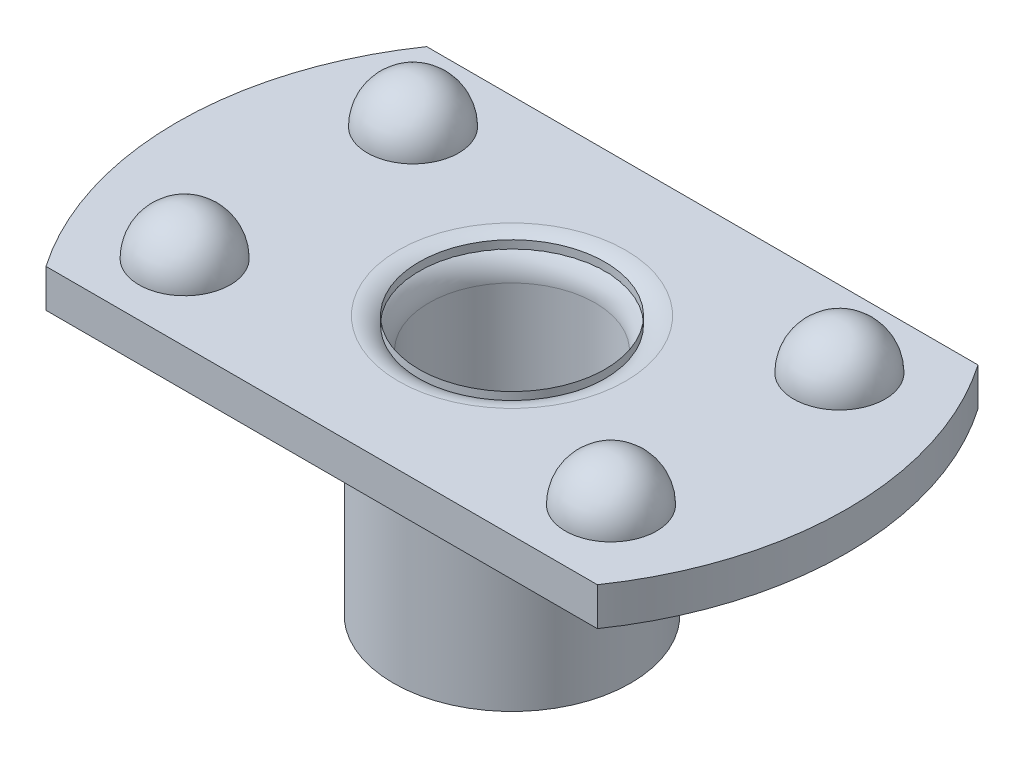
ISO-10303-21;
HEADER;
FILE_DESCRIPTION(('STEP AP214'),'2;1');
FILE_NAME('part.step','',(''),(''),'','','');
FILE_SCHEMA(('AUTOMOTIVE_DESIGN { 1 0 10303 214 1 1 1 1 }'));
ENDSEC;
DATA;
#1=APPLICATION_CONTEXT('core data for automotive mechanical design processes');
#2=APPLICATION_PROTOCOL_DEFINITION('international standard','automotive_design',2000,#1);
#3=PRODUCT_CONTEXT('',#1,'mechanical');
#4=PRODUCT('Part','Part','',(#3));
#5=PRODUCT_RELATED_PRODUCT_CATEGORY('part','',(#4));
#6=PRODUCT_DEFINITION_FORMATION('','',#4);
#7=PRODUCT_DEFINITION_CONTEXT('part definition',#1,'design');
#8=PRODUCT_DEFINITION('design','',#6,#7);
#9=PRODUCT_DEFINITION_SHAPE('','',#8);
#10=(LENGTH_UNIT() NAMED_UNIT(*) SI_UNIT(.MILLI.,.METRE.));
#11=(NAMED_UNIT(*) PLANE_ANGLE_UNIT() SI_UNIT($,.RADIAN.));
#12=(NAMED_UNIT(*) SI_UNIT($,.STERADIAN.) SOLID_ANGLE_UNIT());
#13=UNCERTAINTY_MEASURE_WITH_UNIT(LENGTH_MEASURE(1.E-05),#10,'distance_accuracy_value','');
#14=(GEOMETRIC_REPRESENTATION_CONTEXT(3) GLOBAL_UNCERTAINTY_ASSIGNED_CONTEXT((#13)) GLOBAL_UNIT_ASSIGNED_CONTEXT((#10,
#11,#12)) REPRESENTATION_CONTEXT('',''));
#15=CARTESIAN_POINT('',(0.,0.,0.));
#16=DIRECTION('',(0.,0.,1.));
#17=DIRECTION('',(1.,0.,0.));
#18=AXIS2_PLACEMENT_3D('',#15,#16,#17);
#19=CARTESIAN_POINT('',(0.,-9.99999999999999,84.33));
#20=DIRECTION('',(0.,1.,0.));
#21=DIRECTION('',(-1.,0.,0.));
#22=AXIS2_PLACEMENT_3D('',#19,#20,#21);
#23=CYLINDRICAL_SURFACE('',#22,3.05412658773999);
#24=CARTESIAN_POINT('',(0.,-1.50000000000027,84.33));
#25=DIRECTION('',(0.,1.,0.));
#26=DIRECTION('',(0.,0.,1.));
#27=AXIS2_PLACEMENT_3D('',#24,#25,#26);
#28=CIRCLE('',#27,3.05412658773999);
#29=CARTESIAN_POINT('',(0.,-1.50000000000027,87.38412658774));
#30=VERTEX_POINT('',#29);
#31=EDGE_CURVE('P0_E10',#30,#30,#28,.T.);
#32=ORIENTED_EDGE('',*,*,#31,.T.);
#33=EDGE_LOOP('',(#32));
#34=FACE_BOUND('',#33,.T.);
#35=CARTESIAN_POINT('',(0.,-9.99999999999999,84.33));
#36=DIRECTION('',(0.,1.,0.));
#37=DIRECTION('',(0.,0.,1.));
#38=AXIS2_PLACEMENT_3D('',#35,#36,#37);
#39=CIRCLE('',#38,3.05412658773997);
#40=CARTESIAN_POINT('',(0.,-9.99999999999999,87.38412658774));
#41=VERTEX_POINT('',#40);
#42=EDGE_CURVE('P0_E15',#41,#41,#39,.F.);
#43=ORIENTED_EDGE('',*,*,#42,.T.);
#44=EDGE_LOOP('',(#43));
#45=FACE_BOUND('',#44,.T.);
#46=ADVANCED_FACE('P0_F14',(#34,#45),#23,.F.);
#47=OPEN_SHELL('',(#46));
#48=SHELL_BASED_SURFACE_MODEL('P0_B1',(#47));
#49=CARTESIAN_POINT('',(0.,-3.25,84.33));
#50=DIRECTION('',(0.,1.,0.));
#51=DIRECTION('',(0.,0.,-1.));
#52=AXIS2_PLACEMENT_3D('',#49,#50,#51);
#53=TOROIDAL_SURFACE('',#52,4.39999999999999,0.5);
#54=CARTESIAN_POINT('',(0.,-3.25000000000021,84.33));
#55=DIRECTION('',(0.,1.,0.));
#56=DIRECTION('',(0.,0.,-1.));
#57=AXIS2_PLACEMENT_3D('',#54,#55,#56);
#58=CIRCLE('',#57,3.90000000000001);
#59=CARTESIAN_POINT('',(0.,-3.25000000000021,80.43));
#60=VERTEX_POINT('',#59);
#61=EDGE_CURVE('P1_E95',#60,#60,#58,.T.);
#62=ORIENTED_EDGE('',*,*,#61,.T.);
#63=EDGE_LOOP('',(#62));
#64=FACE_BOUND('',#63,.T.);
#65=CARTESIAN_POINT('',(0.,-2.75,84.33));
#66=DIRECTION('',(0.,-1.,0.));
#67=DIRECTION('',(0.,0.,-1.));
#68=AXIS2_PLACEMENT_3D('',#65,#66,#67);
#69=CIRCLE('',#68,4.39999999999999);
#70=CARTESIAN_POINT('',(3.6344260934129E-13,-2.75,79.93));
#71=VERTEX_POINT('',#70);
#72=CARTESIAN_POINT('',(-5.46659616280914E-13,-2.75,88.73));
#73=VERTEX_POINT('',#72);
#74=EDGE_CURVE('P1_E140',#71,#73,#69,.T.);
#75=ORIENTED_EDGE('',*,*,#74,.T.);
#76=CARTESIAN_POINT('',(0.,-2.75,84.33));
#77=DIRECTION('',(0.,-1.,0.));
#78=DIRECTION('',(-2.07068036470044E-13,0.,1.));
#79=AXIS2_PLACEMENT_3D('',#76,#77,#78);
#80=CIRCLE('',#79,4.39999999999999);
#81=EDGE_CURVE('P1_E114',#73,#71,#80,.T.);
#82=ORIENTED_EDGE('',*,*,#81,.T.);
#83=EDGE_LOOP('',(#75,#82));
#84=FACE_BOUND('',#83,.T.);
#85=ADVANCED_FACE('P1_F16',(#64,#84),#53,.F.);
#86=CARTESIAN_POINT('',(11.44761709894,-2.75,90.83));
#87=DIRECTION('',(0.,1.,0.));
#88=DIRECTION('',(0.,0.,-1.));
#89=AXIS2_PLACEMENT_3D('',#86,#87,#88);
#90=PLANE('',#89);
#91=ORIENTED_EDGE('',*,*,#74,.F.);
#92=ORIENTED_EDGE('',*,*,#81,.F.);
#93=EDGE_LOOP('',(#91,#92));
#94=FACE_BOUND('',#93,.T.);
#95=DIRECTION('',(-1.,0.,0.));
#96=VECTOR('',#95,1.);
#97=CARTESIAN_POINT('',(0.,-2.75000000000017,90.58));
#98=LINE('',#97,#96);
#99=CARTESIAN_POINT('',(9.05193349511453,-2.75000000000016,90.5800000000019));
#100=VERTEX_POINT('',#99);
#101=CARTESIAN_POINT('',(-9.05193349511566,-2.75000000000016,90.58));
#102=VERTEX_POINT('',#101);
#103=EDGE_CURVE('P1_E82',#100,#102,#98,.T.);
#104=ORIENTED_EDGE('',*,*,#103,.T.);
#105=CARTESIAN_POINT('',(0.,-2.75000000000016,84.33));
#106=DIRECTION('',(0.,1.,0.));
#107=DIRECTION('',(0.,0.,1.));
#108=AXIS2_PLACEMENT_3D('',#105,#106,#107);
#109=CIRCLE('',#108,11.);
#110=CARTESIAN_POINT('',(-9.05193349511581,-2.75000000000016,78.08));
#111=VERTEX_POINT('',#110);
#112=EDGE_CURVE('P1_E97',#102,#111,#109,.F.);
#113=ORIENTED_EDGE('',*,*,#112,.T.);
#114=DIRECTION('',(1.,0.,0.));
#115=VECTOR('',#114,1.);
#116=CARTESIAN_POINT('',(0.,-2.75000000000017,78.08));
#117=LINE('',#116,#115);
#118=CARTESIAN_POINT('',(9.0519334951158,-2.75000000000016,78.08));
#119=VERTEX_POINT('',#118);
#120=EDGE_CURVE('P1_E87',#111,#119,#117,.T.);
#121=ORIENTED_EDGE('',*,*,#120,.T.);
#122=CARTESIAN_POINT('',(0.,-2.75000000000016,84.33));
#123=DIRECTION('',(0.,1.,0.));
#124=DIRECTION('',(0.,0.,1.));
#125=AXIS2_PLACEMENT_3D('',#122,#123,#124);
#126=CIRCLE('',#125,11.);
#127=EDGE_CURVE('P1_E203',#119,#100,#126,.F.);
#128=ORIENTED_EDGE('',*,*,#127,.T.);
#129=EDGE_LOOP('',(#104,#113,#121,#128));
#130=FACE_BOUND('',#129,.T.);
#131=ADVANCED_FACE('P1_F98',(#94,#130),#90,.F.);
#132=CARTESIAN_POINT('',(0.,-9.99999999999999,84.33));
#133=DIRECTION('',(0.,1.,0.));
#134=DIRECTION('',(0.,0.,1.));
#135=AXIS2_PLACEMENT_3D('',#132,#133,#134);
#136=CYLINDRICAL_SURFACE('',#135,3.90000000000001);
#137=ORIENTED_EDGE('',*,*,#61,.F.);
#138=EDGE_LOOP('',(#137));
#139=FACE_BOUND('',#138,.T.);
#140=CARTESIAN_POINT('',(0.,-9.99999999999999,84.33));
#141=DIRECTION('',(0.,1.,0.));
#142=DIRECTION('',(0.,0.,1.));
#143=AXIS2_PLACEMENT_3D('',#140,#141,#142);
#144=CIRCLE('',#143,3.90000000000001);
#145=CARTESIAN_POINT('',(0.,-9.99999999999999,88.23));
#146=VERTEX_POINT('',#145);
#147=EDGE_CURVE('P1_E199',#146,#146,#144,.T.);
#148=ORIENTED_EDGE('',*,*,#147,.T.);
#149=EDGE_LOOP('',(#148));
#150=FACE_BOUND('',#149,.T.);
#151=ADVANCED_FACE('P1_F123',(#139,#150),#136,.T.);
#152=CARTESIAN_POINT('',(9.41401083492,-1.461289635087,78.08));
#153=DIRECTION('',(0.,0.,1.));
#154=DIRECTION('',(-1.,0.,0.));
#155=AXIS2_PLACEMENT_3D('',#152,#153,#154);
#156=PLANE('',#155);
#157=ORIENTED_EDGE('',*,*,#120,.F.);
#158=DIRECTION('',(0.,1.,0.));
#159=VECTOR('',#158,1.);
#160=CARTESIAN_POINT('',(-9.05193349511579,-2.125,78.0799999999999));
#161=LINE('',#160,#159);
#162=CARTESIAN_POINT('',(-9.05193349511581,-1.4999999999999,78.08));
#163=VERTEX_POINT('',#162);
#164=EDGE_CURVE('P1_E90',#111,#163,#161,.T.);
#165=ORIENTED_EDGE('',*,*,#164,.T.);
#166=DIRECTION('',(-1.,0.,0.));
#167=VECTOR('',#166,1.);
#168=CARTESIAN_POINT('',(0.,-1.5,78.08));
#169=LINE('',#168,#167);
#170=CARTESIAN_POINT('',(9.0519334951158,-1.4999999999999,78.08));
#171=VERTEX_POINT('',#170);
#172=EDGE_CURVE('P1_E198',#171,#163,#169,.T.);
#173=ORIENTED_EDGE('',*,*,#172,.F.);
#174=DIRECTION('',(0.,-1.,0.));
#175=VECTOR('',#174,1.);
#176=CARTESIAN_POINT('',(9.05193349511578,-2.125,78.0799999999999));
#177=LINE('',#176,#175);
#178=EDGE_CURVE('P1_E93',#171,#119,#177,.T.);
#179=ORIENTED_EDGE('',*,*,#178,.T.);
#180=EDGE_LOOP('',(#157,#165,#173,#179));
#181=FACE_BOUND('',#180,.T.);
#182=ADVANCED_FACE('P1_F88',(#181),#156,.F.);
#183=CARTESIAN_POINT('',(0.,-2.75000000000016,84.33));
#184=DIRECTION('',(0.,1.,0.));
#185=DIRECTION('',(0.,0.,1.));
#186=AXIS2_PLACEMENT_3D('',#183,#184,#185);
#187=CYLINDRICAL_SURFACE('',#186,11.);
#188=DIRECTION('',(0.,1.,0.));
#189=VECTOR('',#188,1.);
#190=CARTESIAN_POINT('',(-9.05193349511549,-2.125,90.58));
#191=LINE('',#190,#189);
#192=CARTESIAN_POINT('',(-9.05193349511567,-1.4999999999999,90.58));
#193=VERTEX_POINT('',#192);
#194=EDGE_CURVE('P1_E109',#102,#193,#191,.T.);
#195=ORIENTED_EDGE('',*,*,#194,.T.);
#196=CARTESIAN_POINT('',(0.,-1.4999999999998,84.33));
#197=DIRECTION('',(0.,1.,0.));
#198=DIRECTION('',(0.,0.,1.));
#199=AXIS2_PLACEMENT_3D('',#196,#197,#198);
#200=CIRCLE('',#199,11.);
#201=EDGE_CURVE('P1_E104',#163,#193,#200,.T.);
#202=ORIENTED_EDGE('',*,*,#201,.F.);
#203=ORIENTED_EDGE('',*,*,#164,.F.);
#204=ORIENTED_EDGE('',*,*,#112,.F.);
#205=EDGE_LOOP('',(#195,#202,#203,#204));
#206=FACE_BOUND('',#205,.T.);
#207=ADVANCED_FACE('P1_F102',(#206),#187,.T.);
#208=CARTESIAN_POINT('',(-9.41401083492,-1.461289635087,90.58));
#209=DIRECTION('',(0.,0.,-1.));
#210=DIRECTION('',(1.,0.,0.));
#211=AXIS2_PLACEMENT_3D('',#208,#209,#210);
#212=PLANE('',#211);
#213=ORIENTED_EDGE('',*,*,#103,.F.);
#214=DIRECTION('',(0.,1.,0.));
#215=VECTOR('',#214,1.);
#216=CARTESIAN_POINT('',(9.05193349511323,-2.125,90.5800000000038));
#217=LINE('',#216,#215);
#218=CARTESIAN_POINT('',(9.05193349511454,-1.4999999999998,90.5800000000019));
#219=VERTEX_POINT('',#218);
#220=EDGE_CURVE('P1_E202',#100,#219,#217,.T.);
#221=ORIENTED_EDGE('',*,*,#220,.T.);
#222=DIRECTION('',(1.,0.,0.));
#223=VECTOR('',#222,1.);
#224=CARTESIAN_POINT('',(0.,-1.5,90.58));
#225=LINE('',#224,#223);
#226=EDGE_CURVE('P1_E196',#193,#219,#225,.T.);
#227=ORIENTED_EDGE('',*,*,#226,.F.);
#228=ORIENTED_EDGE('',*,*,#194,.F.);
#229=EDGE_LOOP('',(#213,#221,#227,#228));
#230=FACE_BOUND('',#229,.T.);
#231=ADVANCED_FACE('P1_F265',(#230),#212,.F.);
#232=CARTESIAN_POINT('',(0.,-2.75000000000016,84.33));
#233=DIRECTION('',(0.,1.,0.));
#234=DIRECTION('',(0.,0.,1.));
#235=AXIS2_PLACEMENT_3D('',#232,#233,#234);
#236=CYLINDRICAL_SURFACE('',#235,11.);
#237=ORIENTED_EDGE('',*,*,#220,.F.);
#238=ORIENTED_EDGE('',*,*,#127,.F.);
#239=ORIENTED_EDGE('',*,*,#178,.F.);
#240=CARTESIAN_POINT('',(0.,-1.4999999999998,84.33));
#241=DIRECTION('',(0.,1.,0.));
#242=DIRECTION('',(0.,0.,1.));
#243=AXIS2_PLACEMENT_3D('',#240,#241,#242);
#244=CIRCLE('',#243,11.);
#245=EDGE_CURVE('P1_E193',#219,#171,#244,.T.);
#246=ORIENTED_EDGE('',*,*,#245,.F.);
#247=EDGE_LOOP('',(#237,#238,#239,#246));
#248=FACE_BOUND('',#247,.T.);
#249=ADVANCED_FACE('P1_F270',(#248),#236,.T.);
#250=CARTESIAN_POINT('',(7.,-1.5,80.58));
#251=DIRECTION('',(0.,-1.,0.));
#252=DIRECTION('',(1.,0.,0.));
#253=AXIS2_PLACEMENT_3D('',#250,#251,#252);
#254=SPHERICAL_SURFACE('',#253,1.5);
#255=CARTESIAN_POINT('',(7.,0.,80.58));
#256=VERTEX_POINT('',#255);
#257=VERTEX_LOOP('',#256);
#258=FACE_BOUND('',#257,.T.);
#259=CARTESIAN_POINT('',(7.,-1.5,80.58));
#260=DIRECTION('',(0.,-1.,0.));
#261=DIRECTION('',(0.,0.,-1.));
#262=AXIS2_PLACEMENT_3D('',#259,#260,#261);
#263=CIRCLE('',#262,1.5);
#264=CARTESIAN_POINT('',(7.,-1.5,79.08));
#265=VERTEX_POINT('',#264);
#266=EDGE_CURVE('P1_E190',#265,#265,#263,.T.);
#267=ORIENTED_EDGE('',*,*,#266,.F.);
#268=EDGE_LOOP('',(#267));
#269=FACE_BOUND('',#268,.T.);
#270=ADVANCED_FACE('P1_F256',(#258,#269),#254,.T.);
#271=CARTESIAN_POINT('',(-7.,-1.5,80.58));
#272=DIRECTION('',(0.,-1.,0.));
#273=DIRECTION('',(1.,0.,0.));
#274=AXIS2_PLACEMENT_3D('',#271,#272,#273);
#275=SPHERICAL_SURFACE('',#274,1.5);
#276=CARTESIAN_POINT('',(-7.,0.,80.58));
#277=VERTEX_POINT('',#276);
#278=VERTEX_LOOP('',#277);
#279=FACE_BOUND('',#278,.T.);
#280=CARTESIAN_POINT('',(-7.,-1.5,80.58));
#281=DIRECTION('',(0.,-1.,0.));
#282=DIRECTION('',(0.,0.,-1.));
#283=AXIS2_PLACEMENT_3D('',#280,#281,#282);
#284=CIRCLE('',#283,1.5);
#285=CARTESIAN_POINT('',(-7.,-1.5,79.08));
#286=VERTEX_POINT('',#285);
#287=EDGE_CURVE('P1_E187',#286,#286,#284,.T.);
#288=ORIENTED_EDGE('',*,*,#287,.F.);
#289=EDGE_LOOP('',(#288));
#290=FACE_BOUND('',#289,.T.);
#291=ADVANCED_FACE('P1_F252',(#279,#290),#275,.T.);
#292=CARTESIAN_POINT('',(7.,-1.5,88.08));
#293=DIRECTION('',(0.,-1.,0.));
#294=DIRECTION('',(1.,0.,0.));
#295=AXIS2_PLACEMENT_3D('',#292,#293,#294);
#296=SPHERICAL_SURFACE('',#295,1.5);
#297=CARTESIAN_POINT('',(7.,0.,88.08));
#298=VERTEX_POINT('',#297);
#299=VERTEX_LOOP('',#298);
#300=FACE_BOUND('',#299,.T.);
#301=CARTESIAN_POINT('',(7.,-1.5,88.08));
#302=DIRECTION('',(0.,-1.,0.));
#303=DIRECTION('',(0.,0.,-1.));
#304=AXIS2_PLACEMENT_3D('',#301,#302,#303);
#305=CIRCLE('',#304,1.5);
#306=CARTESIAN_POINT('',(7.,-1.5,86.58));
#307=VERTEX_POINT('',#306);
#308=EDGE_CURVE('P1_E184',#307,#307,#305,.T.);
#309=ORIENTED_EDGE('',*,*,#308,.F.);
#310=EDGE_LOOP('',(#309));
#311=FACE_BOUND('',#310,.T.);
#312=ADVANCED_FACE('P1_F248',(#300,#311),#296,.T.);
#313=CARTESIAN_POINT('',(-7.,-1.5,88.08));
#314=DIRECTION('',(0.,-1.,0.));
#315=DIRECTION('',(1.,0.,0.));
#316=AXIS2_PLACEMENT_3D('',#313,#314,#315);
#317=SPHERICAL_SURFACE('',#316,1.5);
#318=CARTESIAN_POINT('',(-7.,0.,88.08));
#319=VERTEX_POINT('',#318);
#320=VERTEX_LOOP('',#319);
#321=FACE_BOUND('',#320,.T.);
#322=CARTESIAN_POINT('',(-7.,-1.5,88.08));
#323=DIRECTION('',(0.,-1.,0.));
#324=DIRECTION('',(0.,0.,-1.));
#325=AXIS2_PLACEMENT_3D('',#322,#323,#324);
#326=CIRCLE('',#325,1.5);
#327=CARTESIAN_POINT('',(-7.,-1.5,86.58));
#328=VERTEX_POINT('',#327);
#329=EDGE_CURVE('P1_E181',#328,#328,#326,.T.);
#330=ORIENTED_EDGE('',*,*,#329,.F.);
#331=EDGE_LOOP('',(#330));
#332=FACE_BOUND('',#331,.T.);
#333=ADVANCED_FACE('P1_F244',(#321,#332),#317,.T.);
#334=CARTESIAN_POINT('',(4.05934063717,-10.,88.386));
#335=DIRECTION('',(0.,1.,0.));
#336=DIRECTION('',(0.,0.,-1.));
#337=AXIS2_PLACEMENT_3D('',#334,#335,#336);
#338=PLANE('',#337);
#339=CARTESIAN_POINT('',(0.,-10.,84.33));
#340=DIRECTION('',(0.,1.,0.));
#341=DIRECTION('',(0.,0.,1.));
#342=AXIS2_PLACEMENT_3D('',#339,#340,#341);
#343=CIRCLE('',#342,3.16236765555472);
#344=CARTESIAN_POINT('',(0.,-10.,87.4923676555547));
#345=VERTEX_POINT('',#344);
#346=EDGE_CURVE('P1_E178',#345,#345,#343,.F.);
#347=ORIENTED_EDGE('',*,*,#346,.F.);
#348=EDGE_LOOP('',(#347));
#349=FACE_BOUND('',#348,.T.);
#350=ORIENTED_EDGE('',*,*,#147,.F.);
#351=EDGE_LOOP('',(#350));
#352=FACE_BOUND('',#351,.T.);
#353=ADVANCED_FACE('P1_F247',(#349,#352),#338,.F.);
#354=CARTESIAN_POINT('',(11.44761709894,-1.5,90.83));
#355=DIRECTION('',(0.,1.,0.));
#356=DIRECTION('',(0.,0.,-1.));
#357=AXIS2_PLACEMENT_3D('',#354,#355,#356);
#358=PLANE('',#357);
#359=ORIENTED_EDGE('',*,*,#329,.T.);
#360=EDGE_LOOP('',(#359));
#361=FACE_BOUND('',#360,.T.);
#362=ORIENTED_EDGE('',*,*,#308,.T.);
#363=EDGE_LOOP('',(#362));
#364=FACE_BOUND('',#363,.T.);
#365=ORIENTED_EDGE('',*,*,#287,.T.);
#366=EDGE_LOOP('',(#365));
#367=FACE_BOUND('',#366,.T.);
#368=ORIENTED_EDGE('',*,*,#266,.T.);
#369=EDGE_LOOP('',(#368));
#370=FACE_BOUND('',#369,.T.);
#371=CARTESIAN_POINT('',(0.,-1.5,84.33));
#372=DIRECTION('',(0.,1.,0.));
#373=DIRECTION('',(4.13002965160559E-13,0.,-1.));
#374=AXIS2_PLACEMENT_3D('',#371,#372,#373);
#375=CIRCLE('',#374,3.72936706131999);
#376=CARTESIAN_POINT('',(-4.63339628798153E-13,-1.5,88.0593670613188));
#377=VERTEX_POINT('',#376);
#378=CARTESIAN_POINT('',(3.08047930899455E-13,-1.5,80.6006329386812));
#379=VERTEX_POINT('',#378);
#380=EDGE_CURVE('P1_E37',#377,#379,#375,.F.);
#381=ORIENTED_EDGE('',*,*,#380,.T.);
#382=CARTESIAN_POINT('',(0.,-1.5,84.33));
#383=DIRECTION('',(0.,1.,0.));
#384=DIRECTION('',(-2.07068036470044E-13,0.,1.));
#385=AXIS2_PLACEMENT_3D('',#382,#383,#384);
#386=CIRCLE('',#385,3.72936706131999);
#387=EDGE_CURVE('P1_E167',#379,#377,#386,.F.);
#388=ORIENTED_EDGE('',*,*,#387,.T.);
#389=EDGE_LOOP('',(#381,#388));
#390=FACE_BOUND('',#389,.T.);
#391=ORIENTED_EDGE('',*,*,#226,.T.);
#392=ORIENTED_EDGE('',*,*,#245,.T.);
#393=ORIENTED_EDGE('',*,*,#172,.T.);
#394=ORIENTED_EDGE('',*,*,#201,.T.);
#395=EDGE_LOOP('',(#391,#392,#393,#394));
#396=FACE_BOUND('',#395,.T.);
#397=ADVANCED_FACE('P1_F18',(#361,#364,#367,#370,#390,#396),#358,.T.);
#398=CARTESIAN_POINT('',(0.,-9.24548524604013,84.33));
#399=DIRECTION('',(0.,-1.,0.));
#400=DIRECTION('',(0.,0.,-1.));
#401=AXIS2_PLACEMENT_3D('',#398,#399,#400);
#402=CONICAL_SURFACE('',#401,2.72675002708527,0.523597117739647);
#403=ORIENTED_EDGE('',*,*,#346,.T.);
#404=EDGE_LOOP('',(#403));
#405=FACE_BOUND('',#404,.T.);
#406=CARTESIAN_POINT('',(0.,-9.25001809965455,84.33));
#407=DIRECTION('',(0.,-1.,0.));
#408=DIRECTION('',(0.,0.,-1.));
#409=AXIS2_PLACEMENT_3D('',#406,#407,#408);
#410=CIRCLE('',#409,2.72936706131999);
#411=CARTESIAN_POINT('',(0.,-9.25001809965455,81.60063293868));
#412=VERTEX_POINT('',#411);
#413=EDGE_CURVE('P1_E29',#412,#412,#410,.T.);
#414=ORIENTED_EDGE('',*,*,#413,.F.);
#415=EDGE_LOOP('',(#414));
#416=FACE_BOUND('',#415,.T.);
#417=ADVANCED_FACE('P1_F222',(#405,#416),#402,.F.);
#418=CARTESIAN_POINT('',(0.,-2.5,84.33));
#419=DIRECTION('',(0.,1.,0.));
#420=DIRECTION('',(0.,0.,-1.));
#421=AXIS2_PLACEMENT_3D('',#418,#419,#420);
#422=TOROIDAL_SURFACE('',#421,3.72936706131999,1.);
#423=CARTESIAN_POINT('',(0.,-2.5000000000002,84.33));
#424=DIRECTION('',(0.,1.,0.));
#425=DIRECTION('',(0.,0.,-1.));
#426=AXIS2_PLACEMENT_3D('',#423,#424,#425);
#427=CIRCLE('',#426,2.72936706131999);
#428=CARTESIAN_POINT('',(0.,-2.5000000000002,81.60063293868));
#429=VERTEX_POINT('',#428);
#430=EDGE_CURVE('P1_E11',#429,#429,#427,.T.);
#431=ORIENTED_EDGE('',*,*,#430,.F.);
#432=EDGE_LOOP('',(#431));
#433=FACE_BOUND('',#432,.T.);
#434=ORIENTED_EDGE('',*,*,#387,.F.);
#435=ORIENTED_EDGE('',*,*,#380,.F.);
#436=EDGE_LOOP('',(#434,#435));
#437=FACE_BOUND('',#436,.T.);
#438=ADVANCED_FACE('P1_F210',(#433,#437),#422,.T.);
#439=CARTESIAN_POINT('',(0.,-9.29055669494189,84.33));
#440=DIRECTION('',(0.,1.,0.));
#441=DIRECTION('',(0.,0.,1.));
#442=AXIS2_PLACEMENT_3D('',#439,#440,#441);
#443=CYLINDRICAL_SURFACE('',#442,2.72936706131999);
#444=ORIENTED_EDGE('',*,*,#430,.T.);
#445=EDGE_LOOP('',(#444));
#446=FACE_BOUND('',#445,.T.);
#447=ORIENTED_EDGE('',*,*,#413,.T.);
#448=EDGE_LOOP('',(#447));
#449=FACE_BOUND('',#448,.T.);
#450=ADVANCED_FACE('P1_F221',(#446,#449),#443,.F.);
#451=CLOSED_SHELL('',(#85,#131,#151,#182,#207,#231,#249,#270,#291,#312,#333,#353,#397,#417,#438,#450));
#452=MANIFOLD_SOLID_BREP('P1_B1',#451);
#453=ADVANCED_BREP_SHAPE_REPRESENTATION('',(#18,#452),#14);
#454=MANIFOLD_SURFACE_SHAPE_REPRESENTATION('',(#18,#48),#14);
#455=SHAPE_REPRESENTATION('',(#18),#14);
#456=SHAPE_DEFINITION_REPRESENTATION(#9,#455);
#457=SHAPE_REPRESENTATION_RELATIONSHIP('','',#455,#453);
#458=SHAPE_REPRESENTATION_RELATIONSHIP('','',#455,#454);
ENDSEC;
END-ISO-10303-21;
